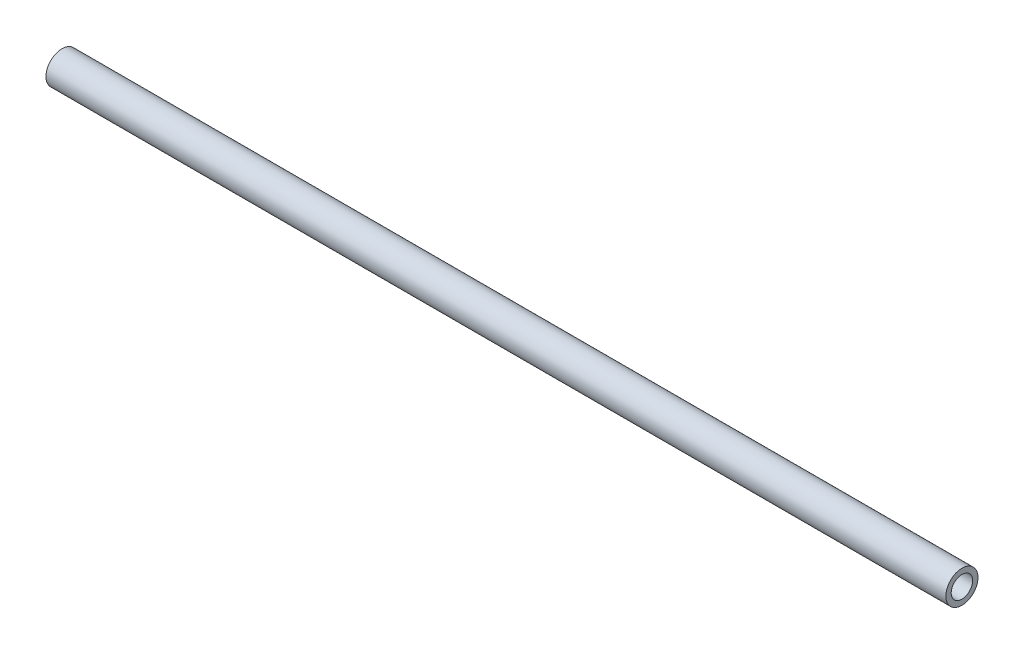
ISO-10303-21;
HEADER;
FILE_DESCRIPTION(('STEP AP214'),'2;1');
FILE_NAME('part.step','',(''),(''),'','','');
FILE_SCHEMA(('AUTOMOTIVE_DESIGN { 1 0 10303 214 1 1 1 1 }'));
ENDSEC;
DATA;
#1=APPLICATION_CONTEXT('core data for automotive mechanical design processes');
#2=APPLICATION_PROTOCOL_DEFINITION('international standard','automotive_design',2000,#1);
#3=PRODUCT_CONTEXT('',#1,'mechanical');
#4=PRODUCT('Part','Part','',(#3));
#5=PRODUCT_RELATED_PRODUCT_CATEGORY('part','',(#4));
#6=PRODUCT_DEFINITION_FORMATION('','',#4);
#7=PRODUCT_DEFINITION_CONTEXT('part definition',#1,'design');
#8=PRODUCT_DEFINITION('design','',#6,#7);
#9=PRODUCT_DEFINITION_SHAPE('','',#8);
#10=(LENGTH_UNIT() NAMED_UNIT(*) SI_UNIT(.MILLI.,.METRE.));
#11=(NAMED_UNIT(*) PLANE_ANGLE_UNIT() SI_UNIT($,.RADIAN.));
#12=(NAMED_UNIT(*) SI_UNIT($,.STERADIAN.) SOLID_ANGLE_UNIT());
#13=UNCERTAINTY_MEASURE_WITH_UNIT(LENGTH_MEASURE(1.E-05),#10,'distance_accuracy_value','');
#14=(GEOMETRIC_REPRESENTATION_CONTEXT(3) GLOBAL_UNCERTAINTY_ASSIGNED_CONTEXT((#13)) GLOBAL_UNIT_ASSIGNED_CONTEXT((#10,
#11,#12)) REPRESENTATION_CONTEXT('',''));
#15=CARTESIAN_POINT('',(0.,0.,0.));
#16=DIRECTION('',(0.,0.,1.));
#17=DIRECTION('',(1.,0.,0.));
#18=AXIS2_PLACEMENT_3D('',#15,#16,#17);
#19=CARTESIAN_POINT('',(266.7,0.,0.));
#20=DIRECTION('',(1.,0.,0.));
#21=DIRECTION('',(0.,0.,-1.));
#22=AXIS2_PLACEMENT_3D('',#19,#20,#21);
#23=PLANE('',#22);
#24=CARTESIAN_POINT('',(266.7,0.,0.));
#25=DIRECTION('',(1.,0.,0.));
#26=DIRECTION('',(0.,0.,-1.));
#27=AXIS2_PLACEMENT_3D('',#24,#25,#26);
#28=CIRCLE('',#27,9.525);
#29=CARTESIAN_POINT('',(266.7,0.,-9.525));
#30=VERTEX_POINT('',#29);
#31=EDGE_CURVE('E10',#30,#30,#28,.T.);
#32=ORIENTED_EDGE('',*,*,#31,.T.);
#33=EDGE_LOOP('',(#32));
#34=FACE_BOUND('',#33,.T.);
#35=CARTESIAN_POINT('',(266.7,0.,0.));
#36=DIRECTION('',(1.,0.,0.));
#37=DIRECTION('',(0.,0.,-1.));
#38=AXIS2_PLACEMENT_3D('',#35,#36,#37);
#39=CIRCLE('',#38,6.35);
#40=CARTESIAN_POINT('',(266.7,0.,-6.35));
#41=VERTEX_POINT('',#40);
#42=EDGE_CURVE('E54',#41,#41,#39,.T.);
#43=ORIENTED_EDGE('',*,*,#42,.F.);
#44=EDGE_LOOP('',(#43));
#45=FACE_BOUND('',#44,.T.);
#46=ADVANCED_FACE('F41',(#34,#45),#23,.T.);
#47=CARTESIAN_POINT('',(-266.7,0.,0.));
#48=DIRECTION('',(1.,0.,0.));
#49=DIRECTION('',(0.,0.,-1.));
#50=AXIS2_PLACEMENT_3D('',#47,#48,#49);
#51=PLANE('',#50);
#52=CARTESIAN_POINT('',(-266.7,0.,0.));
#53=DIRECTION('',(1.,0.,0.));
#54=DIRECTION('',(0.,0.,-1.));
#55=AXIS2_PLACEMENT_3D('',#52,#53,#54);
#56=CIRCLE('',#55,9.525);
#57=CARTESIAN_POINT('',(-266.7,0.,-9.525));
#58=VERTEX_POINT('',#57);
#59=EDGE_CURVE('E45',#58,#58,#56,.T.);
#60=ORIENTED_EDGE('',*,*,#59,.F.);
#61=EDGE_LOOP('',(#60));
#62=FACE_BOUND('',#61,.T.);
#63=CARTESIAN_POINT('',(-266.7,0.,0.));
#64=DIRECTION('',(1.,0.,0.));
#65=DIRECTION('',(0.,0.,-1.));
#66=AXIS2_PLACEMENT_3D('',#63,#64,#65);
#67=CIRCLE('',#66,6.35);
#68=CARTESIAN_POINT('',(-266.7,0.,-6.35));
#69=VERTEX_POINT('',#68);
#70=EDGE_CURVE('E56',#69,#69,#67,.T.);
#71=ORIENTED_EDGE('',*,*,#70,.T.);
#72=EDGE_LOOP('',(#71));
#73=FACE_BOUND('',#72,.T.);
#74=ADVANCED_FACE('F68',(#62,#73),#51,.F.);
#75=CARTESIAN_POINT('',(266.7,0.,0.));
#76=DIRECTION('',(-1.,0.,0.));
#77=DIRECTION('',(0.,0.,1.));
#78=AXIS2_PLACEMENT_3D('',#75,#76,#77);
#79=CYLINDRICAL_SURFACE('',#78,9.525);
#80=ORIENTED_EDGE('',*,*,#31,.F.);
#81=EDGE_LOOP('',(#80));
#82=FACE_BOUND('',#81,.T.);
#83=ORIENTED_EDGE('',*,*,#59,.T.);
#84=EDGE_LOOP('',(#83));
#85=FACE_BOUND('',#84,.T.);
#86=ADVANCED_FACE('F43',(#82,#85),#79,.T.);
#87=CARTESIAN_POINT('',(266.7,0.,0.));
#88=DIRECTION('',(-1.,0.,0.));
#89=DIRECTION('',(0.,0.,1.));
#90=AXIS2_PLACEMENT_3D('',#87,#88,#89);
#91=CYLINDRICAL_SURFACE('',#90,6.35);
#92=ORIENTED_EDGE('',*,*,#42,.T.);
#93=EDGE_LOOP('',(#92));
#94=FACE_BOUND('',#93,.T.);
#95=ORIENTED_EDGE('',*,*,#70,.F.);
#96=EDGE_LOOP('',(#95));
#97=FACE_BOUND('',#96,.T.);
#98=ADVANCED_FACE('F64',(#94,#97),#91,.F.);
#99=CLOSED_SHELL('',(#46,#74,#86,#98));
#100=MANIFOLD_SOLID_BREP('B2',#99);
#101=ADVANCED_BREP_SHAPE_REPRESENTATION('',(#18,#100),#14);
#102=SHAPE_DEFINITION_REPRESENTATION(#9,#101);
ENDSEC;
END-ISO-10303-21;
